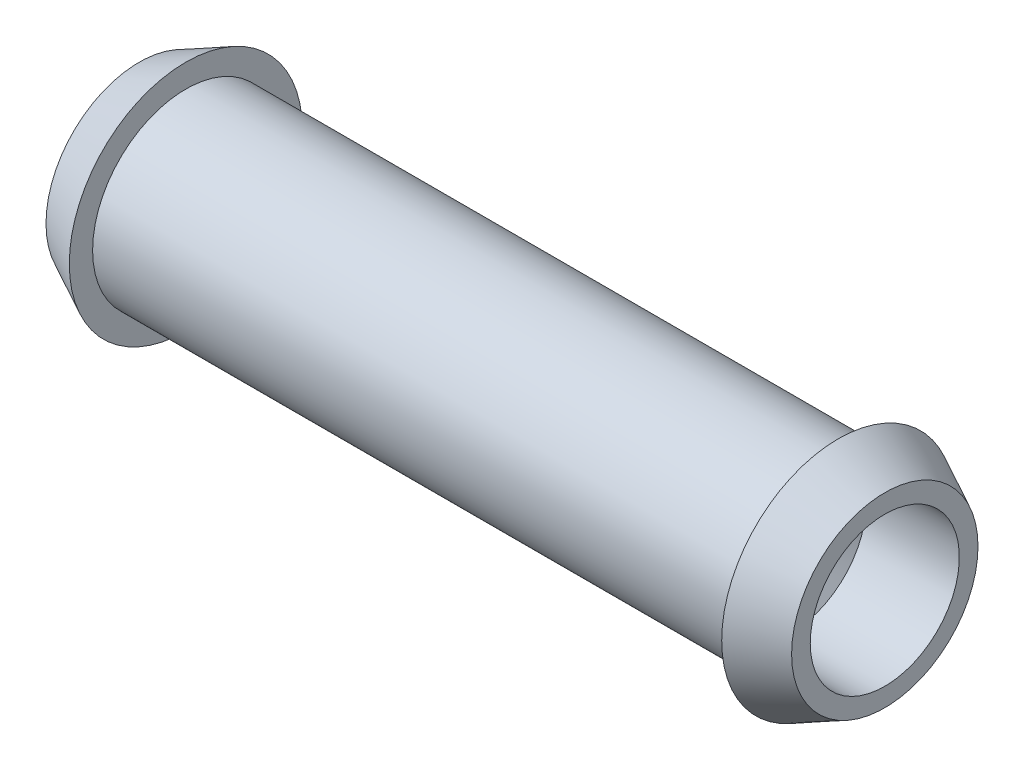
ISO-10303-21;
HEADER;
FILE_DESCRIPTION(('STEP AP214'),'2;1');
FILE_NAME('part.step','',(''),(''),'','','');
FILE_SCHEMA(('AUTOMOTIVE_DESIGN { 1 0 10303 214 1 1 1 1 }'));
ENDSEC;
DATA;
#1=APPLICATION_CONTEXT('core data for automotive mechanical design processes');
#2=APPLICATION_PROTOCOL_DEFINITION('international standard','automotive_design',2000,#1);
#3=PRODUCT_CONTEXT('',#1,'mechanical');
#4=PRODUCT('Part','Part','',(#3));
#5=PRODUCT_RELATED_PRODUCT_CATEGORY('part','',(#4));
#6=PRODUCT_DEFINITION_FORMATION('','',#4);
#7=PRODUCT_DEFINITION_CONTEXT('part definition',#1,'design');
#8=PRODUCT_DEFINITION('design','',#6,#7);
#9=PRODUCT_DEFINITION_SHAPE('','',#8);
#10=(LENGTH_UNIT() NAMED_UNIT(*) SI_UNIT(.MILLI.,.METRE.));
#11=(NAMED_UNIT(*) PLANE_ANGLE_UNIT() SI_UNIT($,.RADIAN.));
#12=(NAMED_UNIT(*) SI_UNIT($,.STERADIAN.) SOLID_ANGLE_UNIT());
#13=UNCERTAINTY_MEASURE_WITH_UNIT(LENGTH_MEASURE(1.E-05),#10,'distance_accuracy_value','');
#14=(GEOMETRIC_REPRESENTATION_CONTEXT(3) GLOBAL_UNCERTAINTY_ASSIGNED_CONTEXT((#13)) GLOBAL_UNIT_ASSIGNED_CONTEXT((#10,
#11,#12)) REPRESENTATION_CONTEXT('',''));
#15=CARTESIAN_POINT('',(0.,0.,0.));
#16=DIRECTION('',(0.,0.,1.));
#17=DIRECTION('',(1.,0.,0.));
#18=AXIS2_PLACEMENT_3D('',#15,#16,#17);
#19=CARTESIAN_POINT('',(-30.,0.,0.));
#20=DIRECTION('',(-1.,0.,0.));
#21=DIRECTION('',(0.,0.,1.));
#22=AXIS2_PLACEMENT_3D('',#19,#20,#21);
#23=CYLINDRICAL_SURFACE('',#22,5.);
#24=CARTESIAN_POINT('',(-17.5,0.,0.));
#25=DIRECTION('',(-1.,0.,0.));
#26=DIRECTION('',(0.,0.,1.));
#27=AXIS2_PLACEMENT_3D('',#24,#25,#26);
#28=CIRCLE('',#27,5.);
#29=CARTESIAN_POINT('',(-17.5,0.,5.));
#30=VERTEX_POINT('',#29);
#31=EDGE_CURVE('E11',#30,#30,#28,.T.);
#32=ORIENTED_EDGE('',*,*,#31,.F.);
#33=EDGE_LOOP('',(#32));
#34=FACE_BOUND('',#33,.T.);
#35=CARTESIAN_POINT('',(17.5,0.,0.));
#36=DIRECTION('',(1.,0.,0.));
#37=DIRECTION('',(0.,0.,-1.));
#38=AXIS2_PLACEMENT_3D('',#35,#36,#37);
#39=CIRCLE('',#38,5.);
#40=CARTESIAN_POINT('',(17.5,0.,-5.));
#41=VERTEX_POINT('',#40);
#42=EDGE_CURVE('E35',#41,#41,#39,.T.);
#43=ORIENTED_EDGE('',*,*,#42,.F.);
#44=EDGE_LOOP('',(#43));
#45=FACE_BOUND('',#44,.T.);
#46=ADVANCED_FACE('F32',(#34,#45),#23,.T.);
#47=CARTESIAN_POINT('',(-17.5,6.25,0.));
#48=DIRECTION('',(-1.,0.,0.));
#49=DIRECTION('',(0.,0.,1.));
#50=AXIS2_PLACEMENT_3D('',#47,#48,#49);
#51=PLANE('',#50);
#52=ORIENTED_EDGE('',*,*,#31,.T.);
#53=EDGE_LOOP('',(#52));
#54=FACE_BOUND('',#53,.T.);
#55=CARTESIAN_POINT('',(-17.5,0.,0.));
#56=DIRECTION('',(-1.,0.,0.));
#57=DIRECTION('',(0.,0.,1.));
#58=AXIS2_PLACEMENT_3D('',#55,#56,#57);
#59=CIRCLE('',#58,6.25);
#60=CARTESIAN_POINT('',(-17.5,0.,6.25));
#61=VERTEX_POINT('',#60);
#62=EDGE_CURVE('E74',#61,#61,#59,.T.);
#63=ORIENTED_EDGE('',*,*,#62,.F.);
#64=EDGE_LOOP('',(#63));
#65=FACE_BOUND('',#64,.T.);
#66=ADVANCED_FACE('F85',(#54,#65),#51,.F.);
#67=CARTESIAN_POINT('',(-17.5,0.,0.));
#68=DIRECTION('',(1.,0.,0.));
#69=DIRECTION('',(0.,0.,-1.));
#70=AXIS2_PLACEMENT_3D('',#67,#68,#69);
#71=CONICAL_SURFACE('',#70,6.25,0.463647609000806);
#72=CARTESIAN_POINT('',(-20.,0.,0.));
#73=DIRECTION('',(-1.,0.,0.));
#74=DIRECTION('',(0.,0.,1.));
#75=AXIS2_PLACEMENT_3D('',#72,#73,#74);
#76=CIRCLE('',#75,5.);
#77=CARTESIAN_POINT('',(-20.,0.,5.));
#78=VERTEX_POINT('',#77);
#79=EDGE_CURVE('E71',#78,#78,#76,.T.);
#80=ORIENTED_EDGE('',*,*,#79,.F.);
#81=EDGE_LOOP('',(#80));
#82=FACE_BOUND('',#81,.T.);
#83=ORIENTED_EDGE('',*,*,#62,.T.);
#84=EDGE_LOOP('',(#83));
#85=FACE_BOUND('',#84,.T.);
#86=ADVANCED_FACE('F90',(#82,#85),#71,.T.);
#87=CARTESIAN_POINT('',(-20.,5.,0.));
#88=DIRECTION('',(1.,0.,0.));
#89=DIRECTION('',(0.,0.,-1.));
#90=AXIS2_PLACEMENT_3D('',#87,#88,#89);
#91=PLANE('',#90);
#92=CARTESIAN_POINT('',(-20.,0.,0.));
#93=DIRECTION('',(-1.,0.,0.));
#94=DIRECTION('',(0.,0.,1.));
#95=AXIS2_PLACEMENT_3D('',#92,#93,#94);
#96=CIRCLE('',#95,4.);
#97=CARTESIAN_POINT('',(-20.,0.,4.));
#98=VERTEX_POINT('',#97);
#99=EDGE_CURVE('E62',#98,#98,#96,.T.);
#100=ORIENTED_EDGE('',*,*,#99,.F.);
#101=EDGE_LOOP('',(#100));
#102=FACE_BOUND('',#101,.T.);
#103=ORIENTED_EDGE('',*,*,#79,.T.);
#104=EDGE_LOOP('',(#103));
#105=FACE_BOUND('',#104,.T.);
#106=ADVANCED_FACE('F97',(#102,#105),#91,.F.);
#107=CARTESIAN_POINT('',(20.,5.,0.));
#108=DIRECTION('',(-1.,0.,0.));
#109=DIRECTION('',(0.,0.,1.));
#110=AXIS2_PLACEMENT_3D('',#107,#108,#109);
#111=PLANE('',#110);
#112=CARTESIAN_POINT('',(20.,0.,0.));
#113=DIRECTION('',(-1.,0.,0.));
#114=DIRECTION('',(0.,0.,1.));
#115=AXIS2_PLACEMENT_3D('',#112,#113,#114);
#116=CIRCLE('',#115,4.);
#117=CARTESIAN_POINT('',(20.,0.,4.));
#118=VERTEX_POINT('',#117);
#119=EDGE_CURVE('E54',#118,#118,#116,.T.);
#120=ORIENTED_EDGE('',*,*,#119,.T.);
#121=EDGE_LOOP('',(#120));
#122=FACE_BOUND('',#121,.T.);
#123=CARTESIAN_POINT('',(20.,0.,0.));
#124=DIRECTION('',(-1.,0.,0.));
#125=DIRECTION('',(0.,0.,1.));
#126=AXIS2_PLACEMENT_3D('',#123,#124,#125);
#127=CIRCLE('',#126,5.);
#128=CARTESIAN_POINT('',(20.,0.,5.));
#129=VERTEX_POINT('',#128);
#130=EDGE_CURVE('E65',#129,#129,#127,.T.);
#131=ORIENTED_EDGE('',*,*,#130,.F.);
#132=EDGE_LOOP('',(#131));
#133=FACE_BOUND('',#132,.T.);
#134=ADVANCED_FACE('F103',(#122,#133),#111,.F.);
#135=CARTESIAN_POINT('',(17.5,6.25,0.));
#136=DIRECTION('',(1.,0.,0.));
#137=DIRECTION('',(0.,0.,-1.));
#138=AXIS2_PLACEMENT_3D('',#135,#136,#137);
#139=PLANE('',#138);
#140=ORIENTED_EDGE('',*,*,#42,.T.);
#141=EDGE_LOOP('',(#140));
#142=FACE_BOUND('',#141,.T.);
#143=CARTESIAN_POINT('',(17.5,0.,0.));
#144=DIRECTION('',(-1.,0.,0.));
#145=DIRECTION('',(0.,0.,1.));
#146=AXIS2_PLACEMENT_3D('',#143,#144,#145);
#147=CIRCLE('',#146,6.25);
#148=CARTESIAN_POINT('',(17.5,0.,6.25));
#149=VERTEX_POINT('',#148);
#150=EDGE_CURVE('E68',#149,#149,#147,.T.);
#151=ORIENTED_EDGE('',*,*,#150,.T.);
#152=EDGE_LOOP('',(#151));
#153=FACE_BOUND('',#152,.T.);
#154=ADVANCED_FACE('F81',(#142,#153),#139,.F.);
#155=CARTESIAN_POINT('',(20.,0.,0.));
#156=DIRECTION('',(-1.,0.,0.));
#157=DIRECTION('',(0.,0.,1.));
#158=AXIS2_PLACEMENT_3D('',#155,#156,#157);
#159=CONICAL_SURFACE('',#158,5.,0.463647609000807);
#160=ORIENTED_EDGE('',*,*,#150,.F.);
#161=EDGE_LOOP('',(#160));
#162=FACE_BOUND('',#161,.T.);
#163=ORIENTED_EDGE('',*,*,#130,.T.);
#164=EDGE_LOOP('',(#163));
#165=FACE_BOUND('',#164,.T.);
#166=ADVANCED_FACE('F110',(#162,#165),#159,.T.);
#167=CARTESIAN_POINT('',(-22.,0.,0.));
#168=DIRECTION('',(-1.,0.,0.));
#169=DIRECTION('',(0.,0.,1.));
#170=AXIS2_PLACEMENT_3D('',#167,#168,#169);
#171=CYLINDRICAL_SURFACE('',#170,4.);
#172=ORIENTED_EDGE('',*,*,#99,.T.);
#173=EDGE_LOOP('',(#172));
#174=FACE_BOUND('',#173,.T.);
#175=CARTESIAN_POINT('',(-15.,0.,0.));
#176=DIRECTION('',(-1.,0.,0.));
#177=DIRECTION('',(0.,0.,1.));
#178=AXIS2_PLACEMENT_3D('',#175,#176,#177);
#179=CIRCLE('',#178,4.);
#180=CARTESIAN_POINT('',(-15.,0.,4.));
#181=VERTEX_POINT('',#180);
#182=EDGE_CURVE('E57',#181,#181,#179,.T.);
#183=ORIENTED_EDGE('',*,*,#182,.F.);
#184=EDGE_LOOP('',(#183));
#185=FACE_BOUND('',#184,.T.);
#186=ADVANCED_FACE('F113',(#174,#185),#171,.F.);
#187=CARTESIAN_POINT('',(-12.6905989232415,0.,0.));
#188=DIRECTION('',(-1.,0.,0.));
#189=DIRECTION('',(0.,0.,1.));
#190=AXIS2_PLACEMENT_3D('',#187,#188,#189);
#191=CONICAL_SURFACE('',#190,0.,1.0471975511966);
#192=ORIENTED_EDGE('',*,*,#182,.T.);
#193=EDGE_LOOP('',(#192));
#194=FACE_BOUND('',#193,.T.);
#195=CARTESIAN_POINT('',(-12.6905989232415,0.,0.));
#196=VERTEX_POINT('',#195);
#197=VERTEX_LOOP('',#196);
#198=FACE_BOUND('',#197,.T.);
#199=ADVANCED_FACE('F117',(#194,#198),#191,.F.);
#200=CARTESIAN_POINT('',(-22.,0.,0.));
#201=DIRECTION('',(-1.,0.,0.));
#202=DIRECTION('',(0.,0.,1.));
#203=AXIS2_PLACEMENT_3D('',#200,#201,#202);
#204=CYLINDRICAL_SURFACE('',#203,4.);
#205=CARTESIAN_POINT('',(15.,0.,0.));
#206=DIRECTION('',(-1.,0.,0.));
#207=DIRECTION('',(0.,0.,1.));
#208=AXIS2_PLACEMENT_3D('',#205,#206,#207);
#209=CIRCLE('',#208,4.);
#210=CARTESIAN_POINT('',(15.,0.,4.));
#211=VERTEX_POINT('',#210);
#212=EDGE_CURVE('E52',#211,#211,#209,.T.);
#213=ORIENTED_EDGE('',*,*,#212,.T.);
#214=EDGE_LOOP('',(#213));
#215=FACE_BOUND('',#214,.T.);
#216=ORIENTED_EDGE('',*,*,#119,.F.);
#217=EDGE_LOOP('',(#216));
#218=FACE_BOUND('',#217,.T.);
#219=ADVANCED_FACE('F48',(#215,#218),#204,.F.);
#220=CARTESIAN_POINT('',(15.,0.,0.));
#221=DIRECTION('',(1.,0.,0.));
#222=DIRECTION('',(0.,0.,-1.));
#223=AXIS2_PLACEMENT_3D('',#220,#221,#222);
#224=CONICAL_SURFACE('',#223,4.,1.0471975511966);
#225=CARTESIAN_POINT('',(12.6905989232415,0.,0.));
#226=VERTEX_POINT('',#225);
#227=VERTEX_LOOP('',#226);
#228=FACE_BOUND('',#227,.T.);
#229=ORIENTED_EDGE('',*,*,#212,.F.);
#230=EDGE_LOOP('',(#229));
#231=FACE_BOUND('',#230,.T.);
#232=ADVANCED_FACE('F45',(#228,#231),#224,.F.);
#233=CLOSED_SHELL('',(#46,#66,#86,#106,#134,#154,#166,#186,#199,#219,#232));
#234=MANIFOLD_SOLID_BREP('B2',#233);
#235=ADVANCED_BREP_SHAPE_REPRESENTATION('',(#18,#234),#14);
#236=SHAPE_DEFINITION_REPRESENTATION(#9,#235);
ENDSEC;
END-ISO-10303-21;
